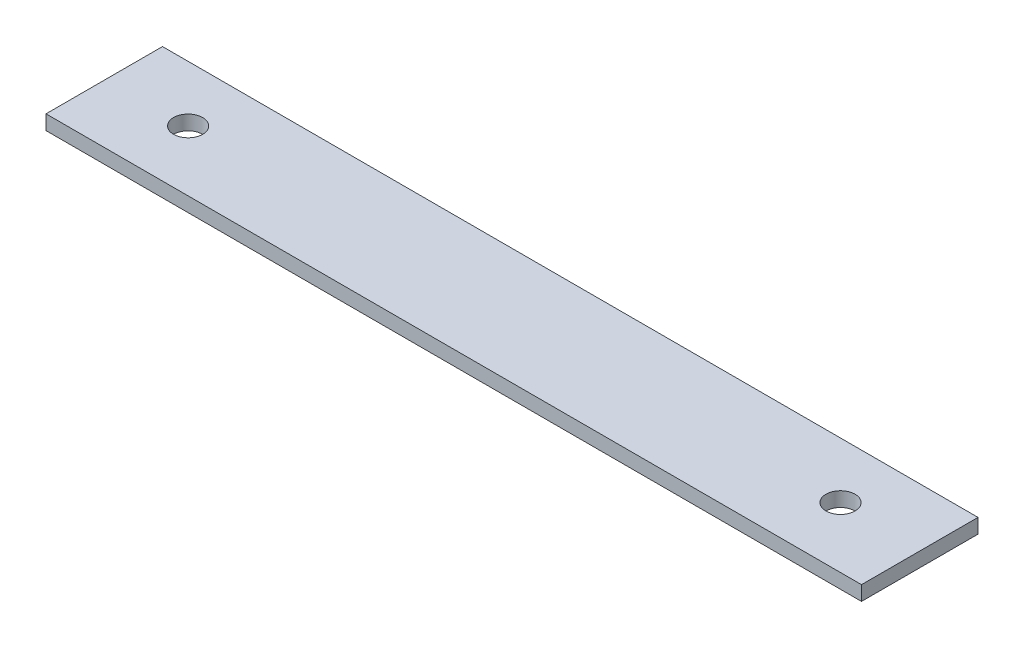
ISO-10303-21;
HEADER;
FILE_DESCRIPTION(('STEP AP214'),'2;1');
FILE_NAME('part.step','',(''),(''),'','','');
FILE_SCHEMA(('AUTOMOTIVE_DESIGN { 1 0 10303 214 1 1 1 1 }'));
ENDSEC;
DATA;
#1=APPLICATION_CONTEXT('core data for automotive mechanical design processes');
#2=APPLICATION_PROTOCOL_DEFINITION('international standard','automotive_design',2000,#1);
#3=PRODUCT_CONTEXT('',#1,'mechanical');
#4=PRODUCT('Part','Part','',(#3));
#5=PRODUCT_RELATED_PRODUCT_CATEGORY('part','',(#4));
#6=PRODUCT_DEFINITION_FORMATION('','',#4);
#7=PRODUCT_DEFINITION_CONTEXT('part definition',#1,'design');
#8=PRODUCT_DEFINITION('design','',#6,#7);
#9=PRODUCT_DEFINITION_SHAPE('','',#8);
#10=(LENGTH_UNIT() NAMED_UNIT(*) SI_UNIT(.MILLI.,.METRE.));
#11=(NAMED_UNIT(*) PLANE_ANGLE_UNIT() SI_UNIT($,.RADIAN.));
#12=(NAMED_UNIT(*) SI_UNIT($,.STERADIAN.) SOLID_ANGLE_UNIT());
#13=UNCERTAINTY_MEASURE_WITH_UNIT(LENGTH_MEASURE(1.E-05),#10,'distance_accuracy_value','');
#14=(GEOMETRIC_REPRESENTATION_CONTEXT(3) GLOBAL_UNCERTAINTY_ASSIGNED_CONTEXT((#13)) GLOBAL_UNIT_ASSIGNED_CONTEXT((#10,
#11,#12)) REPRESENTATION_CONTEXT('',''));
#15=CARTESIAN_POINT('',(0.,0.,0.));
#16=DIRECTION('',(0.,0.,1.));
#17=DIRECTION('',(1.,0.,0.));
#18=AXIS2_PLACEMENT_3D('',#15,#16,#17);
#19=CARTESIAN_POINT('',(0.,3.175,0.));
#20=DIRECTION('',(0.,1.,0.));
#21=DIRECTION('',(0.,0.,1.));
#22=AXIS2_PLACEMENT_3D('',#19,#20,#21);
#23=PLANE('',#22);
#24=CARTESIAN_POINT('',(56.3671374454686,3.175,-11.7612139201018));
#25=DIRECTION('',(0.,1.,0.));
#26=DIRECTION('',(0.,0.,1.));
#27=AXIS2_PLACEMENT_3D('',#24,#25,#26);
#28=CIRCLE('',#27,3.175);
#29=CARTESIAN_POINT('',(56.3671374454686,3.175,-8.58621392010177));
#30=VERTEX_POINT('',#29);
#31=EDGE_CURVE('E100',#30,#30,#28,.T.);
#32=ORIENTED_EDGE('',*,*,#31,.F.);
#33=EDGE_LOOP('',(#32));
#34=FACE_BOUND('',#33,.T.);
#35=DIRECTION('',(0.,0.,1.));
#36=VECTOR('',#35,1.);
#37=CARTESIAN_POINT('',(-103.652862554531,3.175,-23.9580283557629));
#38=LINE('',#37,#36);
#39=CARTESIAN_POINT('',(-103.652862554531,3.175,-23.9580283557629));
#40=VERTEX_POINT('',#39);
#41=CARTESIAN_POINT('',(-103.652862554531,3.175,1.44197164423714));
#42=VERTEX_POINT('',#41);
#43=EDGE_CURVE('E85',#40,#42,#38,.T.);
#44=ORIENTED_EDGE('',*,*,#43,.T.);
#45=DIRECTION('',(1.,0.,0.));
#46=VECTOR('',#45,1.);
#47=CARTESIAN_POINT('',(-103.652862554531,3.175,1.44197164423714));
#48=LINE('',#47,#46);
#49=CARTESIAN_POINT('',(74.1471374454686,3.175,1.44197164423714));
#50=VERTEX_POINT('',#49);
#51=EDGE_CURVE('E80',#42,#50,#48,.T.);
#52=ORIENTED_EDGE('',*,*,#51,.T.);
#53=DIRECTION('',(0.,0.,-1.));
#54=VECTOR('',#53,1.);
#55=CARTESIAN_POINT('',(74.1471374454686,3.175,-23.9580283557629));
#56=LINE('',#55,#54);
#57=CARTESIAN_POINT('',(74.1471374454686,3.175,-23.9580283557629));
#58=VERTEX_POINT('',#57);
#59=EDGE_CURVE('E83',#50,#58,#56,.T.);
#60=ORIENTED_EDGE('',*,*,#59,.T.);
#61=DIRECTION('',(-1.,0.,0.));
#62=VECTOR('',#61,1.);
#63=CARTESIAN_POINT('',(-103.652862554531,3.175,-23.9580283557629));
#64=LINE('',#63,#62);
#65=EDGE_CURVE('E50',#58,#40,#64,.T.);
#66=ORIENTED_EDGE('',*,*,#65,.T.);
#67=EDGE_LOOP('',(#44,#52,#60,#66));
#68=FACE_BOUND('',#67,.T.);
#69=CARTESIAN_POINT('',(-85.8728625545314,3.175,-11.7612139201018));
#70=DIRECTION('',(0.,1.,0.));
#71=DIRECTION('',(0.,0.,1.));
#72=AXIS2_PLACEMENT_3D('',#69,#70,#71);
#73=CIRCLE('',#72,3.175);
#74=CARTESIAN_POINT('',(-85.8728625545314,3.175,-8.58621392010177));
#75=VERTEX_POINT('',#74);
#76=EDGE_CURVE('E115',#75,#75,#73,.T.);
#77=ORIENTED_EDGE('',*,*,#76,.F.);
#78=EDGE_LOOP('',(#77));
#79=FACE_BOUND('',#78,.T.);
#80=ADVANCED_FACE('F33',(#34,#68,#79),#23,.T.);
#81=CARTESIAN_POINT('',(0.,0.,0.));
#82=DIRECTION('',(0.,1.,0.));
#83=DIRECTION('',(0.,0.,1.));
#84=AXIS2_PLACEMENT_3D('',#81,#82,#83);
#85=PLANE('',#84);
#86=CARTESIAN_POINT('',(56.3671374454686,0.,-11.7612139201018));
#87=DIRECTION('',(0.,1.,0.));
#88=DIRECTION('',(0.,0.,1.));
#89=AXIS2_PLACEMENT_3D('',#86,#87,#88);
#90=CIRCLE('',#89,3.175);
#91=CARTESIAN_POINT('',(56.3671374454686,0.,-8.58621392010177));
#92=VERTEX_POINT('',#91);
#93=EDGE_CURVE('E112',#92,#92,#90,.T.);
#94=ORIENTED_EDGE('',*,*,#93,.T.);
#95=EDGE_LOOP('',(#94));
#96=FACE_BOUND('',#95,.T.);
#97=DIRECTION('',(0.,0.,1.));
#98=VECTOR('',#97,1.);
#99=CARTESIAN_POINT('',(-103.652862554531,0.,-23.9580283557629));
#100=LINE('',#99,#98);
#101=CARTESIAN_POINT('',(-103.652862554531,0.,-23.9580283557629));
#102=VERTEX_POINT('',#101);
#103=CARTESIAN_POINT('',(-103.652862554531,0.,1.44197164423714));
#104=VERTEX_POINT('',#103);
#105=EDGE_CURVE('E97',#102,#104,#100,.T.);
#106=ORIENTED_EDGE('',*,*,#105,.F.);
#107=DIRECTION('',(-1.,0.,0.));
#108=VECTOR('',#107,1.);
#109=CARTESIAN_POINT('',(-103.652862554531,0.,-23.9580283557629));
#110=LINE('',#109,#108);
#111=CARTESIAN_POINT('',(74.1471374454686,0.,-23.9580283557629));
#112=VERTEX_POINT('',#111);
#113=EDGE_CURVE('E73',#112,#102,#110,.T.);
#114=ORIENTED_EDGE('',*,*,#113,.F.);
#115=DIRECTION('',(0.,0.,-1.));
#116=VECTOR('',#115,1.);
#117=CARTESIAN_POINT('',(74.1471374454686,0.,-23.9580283557629));
#118=LINE('',#117,#116);
#119=CARTESIAN_POINT('',(74.1471374454686,0.,1.44197164423714));
#120=VERTEX_POINT('',#119);
#121=EDGE_CURVE('E67',#120,#112,#118,.T.);
#122=ORIENTED_EDGE('',*,*,#121,.F.);
#123=DIRECTION('',(1.,0.,0.));
#124=VECTOR('',#123,1.);
#125=CARTESIAN_POINT('',(-103.652862554531,0.,1.44197164423714));
#126=LINE('',#125,#124);
#127=EDGE_CURVE('E89',#104,#120,#126,.T.);
#128=ORIENTED_EDGE('',*,*,#127,.F.);
#129=EDGE_LOOP('',(#106,#114,#122,#128));
#130=FACE_BOUND('',#129,.T.);
#131=CARTESIAN_POINT('',(-85.8728625545314,0.,-11.7612139201018));
#132=DIRECTION('',(0.,1.,0.));
#133=DIRECTION('',(0.,0.,1.));
#134=AXIS2_PLACEMENT_3D('',#131,#132,#133);
#135=CIRCLE('',#134,3.175);
#136=CARTESIAN_POINT('',(-85.8728625545314,0.,-8.58621392010177));
#137=VERTEX_POINT('',#136);
#138=EDGE_CURVE('E118',#137,#137,#135,.T.);
#139=ORIENTED_EDGE('',*,*,#138,.T.);
#140=EDGE_LOOP('',(#139));
#141=FACE_BOUND('',#140,.T.);
#142=ADVANCED_FACE('F108',(#96,#130,#141),#85,.F.);
#143=CARTESIAN_POINT('',(-103.652862554531,3.175,-23.9580283557629));
#144=DIRECTION('',(1.,0.,0.));
#145=DIRECTION('',(0.,0.,-1.));
#146=AXIS2_PLACEMENT_3D('',#143,#144,#145);
#147=PLANE('',#146);
#148=ORIENTED_EDGE('',*,*,#105,.T.);
#149=DIRECTION('',(0.,-1.,0.));
#150=VECTOR('',#149,1.);
#151=CARTESIAN_POINT('',(-103.652862554531,3.175,1.44197164423714));
#152=LINE('',#151,#150);
#153=EDGE_CURVE('E11',#42,#104,#152,.T.);
#154=ORIENTED_EDGE('',*,*,#153,.F.);
#155=ORIENTED_EDGE('',*,*,#43,.F.);
#156=DIRECTION('',(0.,-1.,0.));
#157=VECTOR('',#156,1.);
#158=CARTESIAN_POINT('',(-103.652862554531,3.175,-23.9580283557629));
#159=LINE('',#158,#157);
#160=EDGE_CURVE('E93',#40,#102,#159,.T.);
#161=ORIENTED_EDGE('',*,*,#160,.T.);
#162=EDGE_LOOP('',(#148,#154,#155,#161));
#163=FACE_BOUND('',#162,.T.);
#164=ADVANCED_FACE('F35',(#163),#147,.F.);
#165=CARTESIAN_POINT('',(-103.652862554531,3.175,1.44197164423714));
#166=DIRECTION('',(0.,0.,-1.));
#167=DIRECTION('',(-1.,0.,0.));
#168=AXIS2_PLACEMENT_3D('',#165,#166,#167);
#169=PLANE('',#168);
#170=ORIENTED_EDGE('',*,*,#127,.T.);
#171=DIRECTION('',(0.,-1.,0.));
#172=VECTOR('',#171,1.);
#173=CARTESIAN_POINT('',(74.1471374454686,3.175,1.44197164423714));
#174=LINE('',#173,#172);
#175=EDGE_CURVE('E42',#50,#120,#174,.T.);
#176=ORIENTED_EDGE('',*,*,#175,.F.);
#177=ORIENTED_EDGE('',*,*,#51,.F.);
#178=ORIENTED_EDGE('',*,*,#153,.T.);
#179=EDGE_LOOP('',(#170,#176,#177,#178));
#180=FACE_BOUND('',#179,.T.);
#181=ADVANCED_FACE('F88',(#180),#169,.F.);
#182=CARTESIAN_POINT('',(74.1471374454686,3.175,-23.9580283557629));
#183=DIRECTION('',(-1.,0.,0.));
#184=DIRECTION('',(0.,0.,1.));
#185=AXIS2_PLACEMENT_3D('',#182,#183,#184);
#186=PLANE('',#185);
#187=ORIENTED_EDGE('',*,*,#121,.T.);
#188=DIRECTION('',(0.,-1.,0.));
#189=VECTOR('',#188,1.);
#190=CARTESIAN_POINT('',(74.1471374454686,3.175,-23.9580283557629));
#191=LINE('',#190,#189);
#192=EDGE_CURVE('E90',#58,#112,#191,.T.);
#193=ORIENTED_EDGE('',*,*,#192,.F.);
#194=ORIENTED_EDGE('',*,*,#59,.F.);
#195=ORIENTED_EDGE('',*,*,#175,.T.);
#196=EDGE_LOOP('',(#187,#193,#194,#195));
#197=FACE_BOUND('',#196,.T.);
#198=ADVANCED_FACE('F91',(#197),#186,.F.);
#199=CARTESIAN_POINT('',(-103.652862554531,3.175,-23.9580283557629));
#200=DIRECTION('',(0.,0.,1.));
#201=DIRECTION('',(1.,0.,0.));
#202=AXIS2_PLACEMENT_3D('',#199,#200,#201);
#203=PLANE('',#202);
#204=ORIENTED_EDGE('',*,*,#113,.T.);
#205=ORIENTED_EDGE('',*,*,#160,.F.);
#206=ORIENTED_EDGE('',*,*,#65,.F.);
#207=ORIENTED_EDGE('',*,*,#192,.T.);
#208=EDGE_LOOP('',(#204,#205,#206,#207));
#209=FACE_BOUND('',#208,.T.);
#210=ADVANCED_FACE('F105',(#209),#203,.F.);
#211=CARTESIAN_POINT('',(56.3671374454686,3.175,-11.7612139201018));
#212=DIRECTION('',(0.,-1.,0.));
#213=DIRECTION('',(0.,0.,-1.));
#214=AXIS2_PLACEMENT_3D('',#211,#212,#213);
#215=CYLINDRICAL_SURFACE('',#214,3.175);
#216=ORIENTED_EDGE('',*,*,#31,.T.);
#217=EDGE_LOOP('',(#216));
#218=FACE_BOUND('',#217,.T.);
#219=ORIENTED_EDGE('',*,*,#93,.F.);
#220=EDGE_LOOP('',(#219));
#221=FACE_BOUND('',#220,.T.);
#222=ADVANCED_FACE('F136',(#218,#221),#215,.F.);
#223=CARTESIAN_POINT('',(-85.8728625545314,3.175,-11.7612139201018));
#224=DIRECTION('',(0.,-1.,0.));
#225=DIRECTION('',(0.,0.,-1.));
#226=AXIS2_PLACEMENT_3D('',#223,#224,#225);
#227=CYLINDRICAL_SURFACE('',#226,3.175);
#228=ORIENTED_EDGE('',*,*,#76,.T.);
#229=EDGE_LOOP('',(#228));
#230=FACE_BOUND('',#229,.T.);
#231=ORIENTED_EDGE('',*,*,#138,.F.);
#232=EDGE_LOOP('',(#231));
#233=FACE_BOUND('',#232,.T.);
#234=ADVANCED_FACE('F124',(#230,#233),#227,.F.);
#235=CLOSED_SHELL('',(#80,#142,#164,#181,#198,#210,#222,#234));
#236=MANIFOLD_SOLID_BREP('B2',#235);
#237=ADVANCED_BREP_SHAPE_REPRESENTATION('',(#18,#236),#14);
#238=SHAPE_DEFINITION_REPRESENTATION(#9,#237);
ENDSEC;
END-ISO-10303-21;
